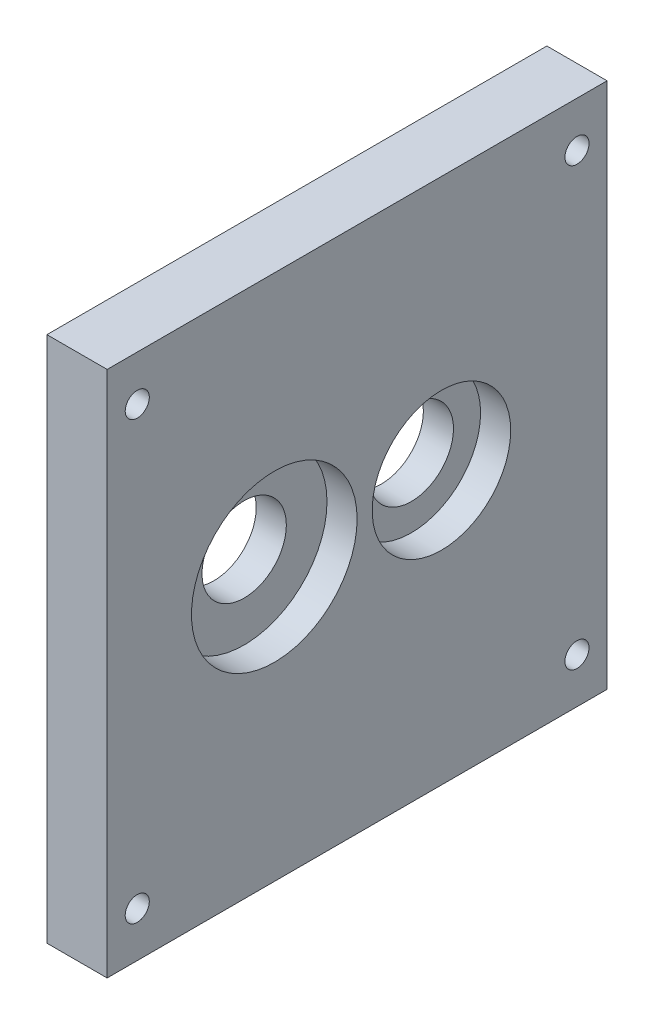
ISO-10303-21;
HEADER;
FILE_DESCRIPTION(('STEP AP214'),'2;1');
FILE_NAME('part.step','',(''),(''),'','','');
FILE_SCHEMA(('AUTOMOTIVE_DESIGN { 1 0 10303 214 1 1 1 1 }'));
ENDSEC;
DATA;
#1=APPLICATION_CONTEXT('core data for automotive mechanical design processes');
#2=APPLICATION_PROTOCOL_DEFINITION('international standard','automotive_design',2000,#1);
#3=PRODUCT_CONTEXT('',#1,'mechanical');
#4=PRODUCT('Part','Part','',(#3));
#5=PRODUCT_RELATED_PRODUCT_CATEGORY('part','',(#4));
#6=PRODUCT_DEFINITION_FORMATION('','',#4);
#7=PRODUCT_DEFINITION_CONTEXT('part definition',#1,'design');
#8=PRODUCT_DEFINITION('design','',#6,#7);
#9=PRODUCT_DEFINITION_SHAPE('','',#8);
#10=(LENGTH_UNIT() NAMED_UNIT(*) SI_UNIT(.MILLI.,.METRE.));
#11=(NAMED_UNIT(*) PLANE_ANGLE_UNIT() SI_UNIT($,.RADIAN.));
#12=(NAMED_UNIT(*) SI_UNIT($,.STERADIAN.) SOLID_ANGLE_UNIT());
#13=UNCERTAINTY_MEASURE_WITH_UNIT(LENGTH_MEASURE(1.E-05),#10,'distance_accuracy_value','');
#14=(GEOMETRIC_REPRESENTATION_CONTEXT(3) GLOBAL_UNCERTAINTY_ASSIGNED_CONTEXT((#13)) GLOBAL_UNIT_ASSIGNED_CONTEXT((#10,
#11,#12)) REPRESENTATION_CONTEXT('',''));
#15=CARTESIAN_POINT('',(0.,0.,0.));
#16=DIRECTION('',(0.,0.,1.));
#17=DIRECTION('',(1.,0.,0.));
#18=AXIS2_PLACEMENT_3D('',#15,#16,#17);
#19=CARTESIAN_POINT('',(-165.,90.5,-28.));
#20=DIRECTION('',(1.,0.,0.));
#21=DIRECTION('',(0.,0.,-1.));
#22=AXIS2_PLACEMENT_3D('',#19,#20,#21);
#23=CYLINDRICAL_SURFACE('',#22,14.);
#24=CARTESIAN_POINT('',(-9.99999999999998,90.5,-28.));
#25=DIRECTION('',(1.,0.,0.));
#26=DIRECTION('',(0.,0.,-1.));
#27=AXIS2_PLACEMENT_3D('',#24,#25,#26);
#28=CIRCLE('',#27,14.);
#29=CARTESIAN_POINT('',(-9.99999999999998,90.5,-42.));
#30=VERTEX_POINT('',#29);
#31=EDGE_CURVE('E127',#30,#30,#28,.T.);
#32=ORIENTED_EDGE('',*,*,#31,.F.);
#33=EDGE_LOOP('',(#32));
#34=FACE_BOUND('',#33,.T.);
#35=CARTESIAN_POINT('',(0.,90.5,-28.));
#36=DIRECTION('',(1.,0.,0.));
#37=DIRECTION('',(0.,0.,-1.));
#38=AXIS2_PLACEMENT_3D('',#35,#36,#37);
#39=CIRCLE('',#38,14.);
#40=CARTESIAN_POINT('',(0.,90.5,-42.));
#41=VERTEX_POINT('',#40);
#42=EDGE_CURVE('E43',#41,#41,#39,.F.);
#43=ORIENTED_EDGE('',*,*,#42,.F.);
#44=EDGE_LOOP('',(#43));
#45=FACE_BOUND('',#44,.T.);
#46=ADVANCED_FACE('F39',(#34,#45),#23,.F.);
#47=CARTESIAN_POINT('',(-165.,90.5,27.5));
#48=DIRECTION('',(1.,0.,0.));
#49=DIRECTION('',(0.,0.,-1.));
#50=AXIS2_PLACEMENT_3D('',#47,#48,#49);
#51=CYLINDRICAL_SURFACE('',#50,14.);
#52=CARTESIAN_POINT('',(-9.99999999999998,90.5,27.5));
#53=DIRECTION('',(1.,0.,0.));
#54=DIRECTION('',(0.,0.,-1.));
#55=AXIS2_PLACEMENT_3D('',#52,#53,#54);
#56=CIRCLE('',#55,14.);
#57=CARTESIAN_POINT('',(-9.99999999999998,90.5,13.5));
#58=VERTEX_POINT('',#57);
#59=EDGE_CURVE('E116',#58,#58,#56,.T.);
#60=ORIENTED_EDGE('',*,*,#59,.F.);
#61=EDGE_LOOP('',(#60));
#62=FACE_BOUND('',#61,.T.);
#63=CARTESIAN_POINT('',(0.,90.5,27.5));
#64=DIRECTION('',(1.,0.,0.));
#65=DIRECTION('',(0.,0.,-1.));
#66=AXIS2_PLACEMENT_3D('',#63,#64,#65);
#67=CIRCLE('',#66,14.);
#68=CARTESIAN_POINT('',(0.,90.5,13.5));
#69=VERTEX_POINT('',#68);
#70=EDGE_CURVE('E133',#69,#69,#67,.F.);
#71=ORIENTED_EDGE('',*,*,#70,.F.);
#72=EDGE_LOOP('',(#71));
#73=FACE_BOUND('',#72,.T.);
#74=ADVANCED_FACE('F229',(#62,#73),#51,.F.);
#75=CARTESIAN_POINT('',(10.,175.,-83.));
#76=DIRECTION('',(-1.,0.,0.));
#77=DIRECTION('',(0.,0.,1.));
#78=AXIS2_PLACEMENT_3D('',#75,#76,#77);
#79=PLANE('',#78);
#80=CARTESIAN_POINT('',(10.,160.,73.));
#81=DIRECTION('',(1.,0.,0.));
#82=DIRECTION('',(0.,0.,1.));
#83=AXIS2_PLACEMENT_3D('',#80,#81,#82);
#84=CIRCLE('',#83,4.00000000000001);
#85=CARTESIAN_POINT('',(10.,160.,77.));
#86=VERTEX_POINT('',#85);
#87=EDGE_CURVE('E170',#86,#86,#84,.T.);
#88=ORIENTED_EDGE('',*,*,#87,.F.);
#89=EDGE_LOOP('',(#88));
#90=FACE_BOUND('',#89,.T.);
#91=CARTESIAN_POINT('',(10.,15.,73.));
#92=DIRECTION('',(1.,0.,0.));
#93=DIRECTION('',(0.,0.,-1.));
#94=AXIS2_PLACEMENT_3D('',#91,#92,#93);
#95=CIRCLE('',#94,4.00000000000001);
#96=CARTESIAN_POINT('',(10.,15.,69.));
#97=VERTEX_POINT('',#96);
#98=EDGE_CURVE('E177',#97,#97,#95,.T.);
#99=ORIENTED_EDGE('',*,*,#98,.F.);
#100=EDGE_LOOP('',(#99));
#101=FACE_BOUND('',#100,.T.);
#102=CARTESIAN_POINT('',(10.,15.,-73.));
#103=DIRECTION('',(1.,0.,0.));
#104=DIRECTION('',(0.,0.,1.));
#105=AXIS2_PLACEMENT_3D('',#102,#103,#104);
#106=CIRCLE('',#105,4.00000000000001);
#107=CARTESIAN_POINT('',(10.,15.,-69.));
#108=VERTEX_POINT('',#107);
#109=EDGE_CURVE('E183',#108,#108,#106,.T.);
#110=ORIENTED_EDGE('',*,*,#109,.F.);
#111=EDGE_LOOP('',(#110));
#112=FACE_BOUND('',#111,.T.);
#113=CARTESIAN_POINT('',(10.,160.,-73.));
#114=DIRECTION('',(1.,0.,0.));
#115=DIRECTION('',(0.,0.,-1.));
#116=AXIS2_PLACEMENT_3D('',#113,#114,#115);
#117=CIRCLE('',#116,4.00000000000001);
#118=CARTESIAN_POINT('',(10.,160.,-77.));
#119=VERTEX_POINT('',#118);
#120=EDGE_CURVE('E152',#119,#119,#117,.T.);
#121=ORIENTED_EDGE('',*,*,#120,.F.);
#122=EDGE_LOOP('',(#121));
#123=FACE_BOUND('',#122,.T.);
#124=CARTESIAN_POINT('',(10.,90.5,27.5));
#125=DIRECTION('',(1.,0.,0.));
#126=DIRECTION('',(0.,0.,-1.));
#127=AXIS2_PLACEMENT_3D('',#124,#125,#126);
#128=CIRCLE('',#127,27.5);
#129=CARTESIAN_POINT('',(10.,90.5,0.));
#130=VERTEX_POINT('',#129);
#131=EDGE_CURVE('E143',#130,#130,#128,.T.);
#132=ORIENTED_EDGE('',*,*,#131,.F.);
#133=EDGE_LOOP('',(#132));
#134=FACE_BOUND('',#133,.T.);
#135=CARTESIAN_POINT('',(10.,90.5,-28.));
#136=DIRECTION('',(1.,0.,0.));
#137=DIRECTION('',(0.,0.,-1.));
#138=AXIS2_PLACEMENT_3D('',#135,#136,#137);
#139=CIRCLE('',#138,23.);
#140=CARTESIAN_POINT('',(10.,90.5,-51.));
#141=VERTEX_POINT('',#140);
#142=EDGE_CURVE('E158',#141,#141,#139,.T.);
#143=ORIENTED_EDGE('',*,*,#142,.F.);
#144=EDGE_LOOP('',(#143));
#145=FACE_BOUND('',#144,.T.);
#146=DIRECTION('',(0.,0.,-1.));
#147=VECTOR('',#146,1.);
#148=CARTESIAN_POINT('',(10.,0.,-83.));
#149=LINE('',#148,#147);
#150=CARTESIAN_POINT('',(10.,0.,83.));
#151=VERTEX_POINT('',#150);
#152=CARTESIAN_POINT('',(10.,0.,-83.));
#153=VERTEX_POINT('',#152);
#154=EDGE_CURVE('E112',#151,#153,#149,.T.);
#155=ORIENTED_EDGE('',*,*,#154,.T.);
#156=DIRECTION('',(0.,-1.,0.));
#157=VECTOR('',#156,1.);
#158=CARTESIAN_POINT('',(10.,175.,-83.));
#159=LINE('',#158,#157);
#160=CARTESIAN_POINT('',(10.,175.,-83.));
#161=VERTEX_POINT('',#160);
#162=EDGE_CURVE('E11',#161,#153,#159,.T.);
#163=ORIENTED_EDGE('',*,*,#162,.F.);
#164=DIRECTION('',(0.,0.,-1.));
#165=VECTOR('',#164,1.);
#166=CARTESIAN_POINT('',(10.,175.,-83.));
#167=LINE('',#166,#165);
#168=CARTESIAN_POINT('',(10.,175.,83.));
#169=VERTEX_POINT('',#168);
#170=EDGE_CURVE('E94',#169,#161,#167,.T.);
#171=ORIENTED_EDGE('',*,*,#170,.F.);
#172=DIRECTION('',(0.,-1.,0.));
#173=VECTOR('',#172,1.);
#174=CARTESIAN_POINT('',(10.,175.,83.));
#175=LINE('',#174,#173);
#176=EDGE_CURVE('E108',#169,#151,#175,.T.);
#177=ORIENTED_EDGE('',*,*,#176,.T.);
#178=EDGE_LOOP('',(#155,#163,#171,#177));
#179=FACE_BOUND('',#178,.T.);
#180=ADVANCED_FACE('F41',(#90,#101,#112,#123,#134,#145,#179),#79,.F.);
#181=CARTESIAN_POINT('',(10.,175.,-83.));
#182=DIRECTION('',(0.,0.,1.));
#183=DIRECTION('',(1.,0.,0.));
#184=AXIS2_PLACEMENT_3D('',#181,#182,#183);
#185=PLANE('',#184);
#186=DIRECTION('',(-1.,0.,0.));
#187=VECTOR('',#186,1.);
#188=CARTESIAN_POINT('',(10.,0.,-83.));
#189=LINE('',#188,#187);
#190=CARTESIAN_POINT('',(-9.99999999999998,0.,-83.));
#191=VERTEX_POINT('',#190);
#192=EDGE_CURVE('E99',#153,#191,#189,.T.);
#193=ORIENTED_EDGE('',*,*,#192,.T.);
#194=DIRECTION('',(0.,-1.,0.));
#195=VECTOR('',#194,1.);
#196=CARTESIAN_POINT('',(-9.99999999999998,175.,-83.));
#197=LINE('',#196,#195);
#198=CARTESIAN_POINT('',(-9.99999999999998,175.,-83.));
#199=VERTEX_POINT('',#198);
#200=EDGE_CURVE('E50',#199,#191,#197,.T.);
#201=ORIENTED_EDGE('',*,*,#200,.F.);
#202=DIRECTION('',(-1.,0.,0.));
#203=VECTOR('',#202,1.);
#204=CARTESIAN_POINT('',(10.,175.,-83.));
#205=LINE('',#204,#203);
#206=EDGE_CURVE('E89',#161,#199,#205,.T.);
#207=ORIENTED_EDGE('',*,*,#206,.F.);
#208=ORIENTED_EDGE('',*,*,#162,.T.);
#209=EDGE_LOOP('',(#193,#201,#207,#208));
#210=FACE_BOUND('',#209,.T.);
#211=ADVANCED_FACE('F98',(#210),#185,.F.);
#212=CARTESIAN_POINT('',(-9.99999999999998,175.,-83.));
#213=DIRECTION('',(1.,0.,0.));
#214=DIRECTION('',(0.,0.,-1.));
#215=AXIS2_PLACEMENT_3D('',#212,#213,#214);
#216=PLANE('',#215);
#217=CARTESIAN_POINT('',(-9.99999999999998,160.,73.));
#218=DIRECTION('',(1.,0.,0.));
#219=DIRECTION('',(0.,0.,1.));
#220=AXIS2_PLACEMENT_3D('',#217,#218,#219);
#221=CIRCLE('',#220,4.00000000000001);
#222=CARTESIAN_POINT('',(-9.99999999999998,160.,77.));
#223=VERTEX_POINT('',#222);
#224=EDGE_CURVE('E173',#223,#223,#221,.T.);
#225=ORIENTED_EDGE('',*,*,#224,.T.);
#226=EDGE_LOOP('',(#225));
#227=FACE_BOUND('',#226,.T.);
#228=CARTESIAN_POINT('',(-9.99999999999998,15.,73.));
#229=DIRECTION('',(1.,0.,0.));
#230=DIRECTION('',(0.,0.,-1.));
#231=AXIS2_PLACEMENT_3D('',#228,#229,#230);
#232=CIRCLE('',#231,4.00000000000001);
#233=CARTESIAN_POINT('',(-9.99999999999998,15.,69.));
#234=VERTEX_POINT('',#233);
#235=EDGE_CURVE('E180',#234,#234,#232,.T.);
#236=ORIENTED_EDGE('',*,*,#235,.T.);
#237=EDGE_LOOP('',(#236));
#238=FACE_BOUND('',#237,.T.);
#239=CARTESIAN_POINT('',(-9.99999999999998,15.,-73.));
#240=DIRECTION('',(1.,0.,0.));
#241=DIRECTION('',(0.,0.,1.));
#242=AXIS2_PLACEMENT_3D('',#239,#240,#241);
#243=CIRCLE('',#242,4.00000000000001);
#244=CARTESIAN_POINT('',(-9.99999999999998,15.,-69.));
#245=VERTEX_POINT('',#244);
#246=EDGE_CURVE('E168',#245,#245,#243,.T.);
#247=ORIENTED_EDGE('',*,*,#246,.T.);
#248=EDGE_LOOP('',(#247));
#249=FACE_BOUND('',#248,.T.);
#250=CARTESIAN_POINT('',(-9.99999999999998,160.,-73.));
#251=DIRECTION('',(1.,0.,0.));
#252=DIRECTION('',(0.,0.,-1.));
#253=AXIS2_PLACEMENT_3D('',#250,#251,#252);
#254=CIRCLE('',#253,4.00000000000001);
#255=CARTESIAN_POINT('',(-9.99999999999998,160.,-77.));
#256=VERTEX_POINT('',#255);
#257=EDGE_CURVE('E160',#256,#256,#254,.T.);
#258=ORIENTED_EDGE('',*,*,#257,.T.);
#259=EDGE_LOOP('',(#258));
#260=FACE_BOUND('',#259,.T.);
#261=ORIENTED_EDGE('',*,*,#59,.T.);
#262=EDGE_LOOP('',(#261));
#263=FACE_BOUND('',#262,.T.);
#264=ORIENTED_EDGE('',*,*,#31,.T.);
#265=EDGE_LOOP('',(#264));
#266=FACE_BOUND('',#265,.T.);
#267=DIRECTION('',(0.,0.,1.));
#268=VECTOR('',#267,1.);
#269=CARTESIAN_POINT('',(-9.99999999999998,0.,-83.));
#270=LINE('',#269,#268);
#271=CARTESIAN_POINT('',(-9.99999999999998,0.,83.));
#272=VERTEX_POINT('',#271);
#273=EDGE_CURVE('E76',#191,#272,#270,.T.);
#274=ORIENTED_EDGE('',*,*,#273,.T.);
#275=DIRECTION('',(0.,-1.,0.));
#276=VECTOR('',#275,1.);
#277=CARTESIAN_POINT('',(-9.99999999999998,175.,83.));
#278=LINE('',#277,#276);
#279=CARTESIAN_POINT('',(-9.99999999999998,175.,83.));
#280=VERTEX_POINT('',#279);
#281=EDGE_CURVE('E101',#280,#272,#278,.T.);
#282=ORIENTED_EDGE('',*,*,#281,.F.);
#283=DIRECTION('',(0.,0.,1.));
#284=VECTOR('',#283,1.);
#285=CARTESIAN_POINT('',(-9.99999999999998,175.,-83.));
#286=LINE('',#285,#284);
#287=EDGE_CURVE('E92',#199,#280,#286,.T.);
#288=ORIENTED_EDGE('',*,*,#287,.F.);
#289=ORIENTED_EDGE('',*,*,#200,.T.);
#290=EDGE_LOOP('',(#274,#282,#288,#289));
#291=FACE_BOUND('',#290,.T.);
#292=ADVANCED_FACE('F103',(#227,#238,#249,#260,#263,#266,#291),#216,.F.);
#293=CARTESIAN_POINT('',(10.,175.,83.));
#294=DIRECTION('',(0.,0.,-1.));
#295=DIRECTION('',(-1.,0.,0.));
#296=AXIS2_PLACEMENT_3D('',#293,#294,#295);
#297=PLANE('',#296);
#298=DIRECTION('',(1.,0.,0.));
#299=VECTOR('',#298,1.);
#300=CARTESIAN_POINT('',(10.,0.,83.));
#301=LINE('',#300,#299);
#302=EDGE_CURVE('E82',#272,#151,#301,.T.);
#303=ORIENTED_EDGE('',*,*,#302,.T.);
#304=ORIENTED_EDGE('',*,*,#176,.F.);
#305=DIRECTION('',(1.,0.,0.));
#306=VECTOR('',#305,1.);
#307=CARTESIAN_POINT('',(10.,175.,83.));
#308=LINE('',#307,#306);
#309=EDGE_CURVE('E59',#280,#169,#308,.T.);
#310=ORIENTED_EDGE('',*,*,#309,.F.);
#311=ORIENTED_EDGE('',*,*,#281,.T.);
#312=EDGE_LOOP('',(#303,#304,#310,#311));
#313=FACE_BOUND('',#312,.T.);
#314=ADVANCED_FACE('F218',(#313),#297,.F.);
#315=CARTESIAN_POINT('',(0.,175.,0.));
#316=DIRECTION('',(0.,-1.,0.));
#317=DIRECTION('',(0.,0.,-1.));
#318=AXIS2_PLACEMENT_3D('',#315,#316,#317);
#319=PLANE('',#318);
#320=ORIENTED_EDGE('',*,*,#170,.T.);
#321=ORIENTED_EDGE('',*,*,#206,.T.);
#322=ORIENTED_EDGE('',*,*,#287,.T.);
#323=ORIENTED_EDGE('',*,*,#309,.T.);
#324=EDGE_LOOP('',(#320,#321,#322,#323));
#325=FACE_BOUND('',#324,.T.);
#326=ADVANCED_FACE('F90',(#325),#319,.F.);
#327=CARTESIAN_POINT('',(0.,0.,0.));
#328=DIRECTION('',(0.,-1.,0.));
#329=DIRECTION('',(0.,0.,-1.));
#330=AXIS2_PLACEMENT_3D('',#327,#328,#329);
#331=PLANE('',#330);
#332=CARTESIAN_POINT('',(0.,0.,-50.));
#333=DIRECTION('',(0.,-1.,0.));
#334=DIRECTION('',(0.,0.,-1.));
#335=AXIS2_PLACEMENT_3D('',#332,#333,#334);
#336=CIRCLE('',#335,4.);
#337=CARTESIAN_POINT('',(0.,0.,-54.));
#338=VERTEX_POINT('',#337);
#339=EDGE_CURVE('E194',#338,#338,#336,.T.);
#340=ORIENTED_EDGE('',*,*,#339,.F.);
#341=EDGE_LOOP('',(#340));
#342=FACE_BOUND('',#341,.T.);
#343=CARTESIAN_POINT('',(0.,0.,50.));
#344=DIRECTION('',(0.,-1.,0.));
#345=DIRECTION('',(0.,0.,1.));
#346=AXIS2_PLACEMENT_3D('',#343,#344,#345);
#347=CIRCLE('',#346,4.);
#348=CARTESIAN_POINT('',(0.,0.,54.));
#349=VERTEX_POINT('',#348);
#350=EDGE_CURVE('E188',#349,#349,#347,.T.);
#351=ORIENTED_EDGE('',*,*,#350,.F.);
#352=EDGE_LOOP('',(#351));
#353=FACE_BOUND('',#352,.T.);
#354=ORIENTED_EDGE('',*,*,#154,.F.);
#355=ORIENTED_EDGE('',*,*,#302,.F.);
#356=ORIENTED_EDGE('',*,*,#273,.F.);
#357=ORIENTED_EDGE('',*,*,#192,.F.);
#358=EDGE_LOOP('',(#354,#355,#356,#357));
#359=FACE_BOUND('',#358,.T.);
#360=ADVANCED_FACE('F209',(#342,#353,#359),#331,.T.);
#361=CARTESIAN_POINT('',(0.,90.5,27.5));
#362=DIRECTION('',(1.,0.,0.));
#363=DIRECTION('',(0.,0.,-1.));
#364=AXIS2_PLACEMENT_3D('',#361,#362,#363);
#365=PLANE('',#364);
#366=CARTESIAN_POINT('',(0.,90.5,27.5));
#367=DIRECTION('',(1.,0.,0.));
#368=DIRECTION('',(0.,0.,-1.));
#369=AXIS2_PLACEMENT_3D('',#366,#367,#368);
#370=CIRCLE('',#369,27.5);
#371=CARTESIAN_POINT('',(0.,90.5,0.));
#372=VERTEX_POINT('',#371);
#373=EDGE_CURVE('E136',#372,#372,#370,.T.);
#374=ORIENTED_EDGE('',*,*,#373,.T.);
#375=EDGE_LOOP('',(#374));
#376=FACE_BOUND('',#375,.T.);
#377=ORIENTED_EDGE('',*,*,#70,.T.);
#378=EDGE_LOOP('',(#377));
#379=FACE_BOUND('',#378,.T.);
#380=ADVANCED_FACE('F212',(#376,#379),#365,.T.);
#381=CARTESIAN_POINT('',(0.,90.5,27.5));
#382=DIRECTION('',(1.,0.,0.));
#383=DIRECTION('',(0.,0.,-1.));
#384=AXIS2_PLACEMENT_3D('',#381,#382,#383);
#385=CYLINDRICAL_SURFACE('',#384,27.5);
#386=ORIENTED_EDGE('',*,*,#373,.F.);
#387=EDGE_LOOP('',(#386));
#388=FACE_BOUND('',#387,.T.);
#389=ORIENTED_EDGE('',*,*,#131,.T.);
#390=EDGE_LOOP('',(#389));
#391=FACE_BOUND('',#390,.T.);
#392=ADVANCED_FACE('F248',(#388,#391),#385,.F.);
#393=CARTESIAN_POINT('',(0.,90.5,-28.));
#394=DIRECTION('',(1.,0.,0.));
#395=DIRECTION('',(0.,0.,-1.));
#396=AXIS2_PLACEMENT_3D('',#393,#394,#395);
#397=PLANE('',#396);
#398=CARTESIAN_POINT('',(0.,90.5,-28.));
#399=DIRECTION('',(1.,0.,0.));
#400=DIRECTION('',(0.,0.,-1.));
#401=AXIS2_PLACEMENT_3D('',#398,#399,#400);
#402=CIRCLE('',#401,23.);
#403=CARTESIAN_POINT('',(0.,90.5,-51.));
#404=VERTEX_POINT('',#403);
#405=EDGE_CURVE('E149',#404,#404,#402,.T.);
#406=ORIENTED_EDGE('',*,*,#405,.T.);
#407=EDGE_LOOP('',(#406));
#408=FACE_BOUND('',#407,.T.);
#409=ORIENTED_EDGE('',*,*,#42,.T.);
#410=EDGE_LOOP('',(#409));
#411=FACE_BOUND('',#410,.T.);
#412=ADVANCED_FACE('F244',(#408,#411),#397,.T.);
#413=CARTESIAN_POINT('',(0.,90.5,-28.));
#414=DIRECTION('',(1.,0.,0.));
#415=DIRECTION('',(0.,0.,-1.));
#416=AXIS2_PLACEMENT_3D('',#413,#414,#415);
#417=CYLINDRICAL_SURFACE('',#416,23.);
#418=ORIENTED_EDGE('',*,*,#405,.F.);
#419=EDGE_LOOP('',(#418));
#420=FACE_BOUND('',#419,.T.);
#421=ORIENTED_EDGE('',*,*,#142,.T.);
#422=EDGE_LOOP('',(#421));
#423=FACE_BOUND('',#422,.T.);
#424=ADVANCED_FACE('F240',(#420,#423),#417,.F.);
#425=CARTESIAN_POINT('',(-9.99999999999998,160.,-73.));
#426=DIRECTION('',(1.,0.,0.));
#427=DIRECTION('',(0.,0.,-1.));
#428=AXIS2_PLACEMENT_3D('',#425,#426,#427);
#429=CYLINDRICAL_SURFACE('',#428,4.00000000000001);
#430=ORIENTED_EDGE('',*,*,#257,.F.);
#431=EDGE_LOOP('',(#430));
#432=FACE_BOUND('',#431,.T.);
#433=ORIENTED_EDGE('',*,*,#120,.T.);
#434=EDGE_LOOP('',(#433));
#435=FACE_BOUND('',#434,.T.);
#436=ADVANCED_FACE('F243',(#432,#435),#429,.F.);
#437=CARTESIAN_POINT('',(-9.99999999999998,15.,-73.));
#438=DIRECTION('',(1.,0.,0.));
#439=DIRECTION('',(0.,0.,-1.));
#440=AXIS2_PLACEMENT_3D('',#437,#438,#439);
#441=CYLINDRICAL_SURFACE('',#440,4.00000000000001);
#442=ORIENTED_EDGE('',*,*,#246,.F.);
#443=EDGE_LOOP('',(#442));
#444=FACE_BOUND('',#443,.T.);
#445=ORIENTED_EDGE('',*,*,#109,.T.);
#446=EDGE_LOOP('',(#445));
#447=FACE_BOUND('',#446,.T.);
#448=ADVANCED_FACE('F257',(#444,#447),#441,.F.);
#449=CARTESIAN_POINT('',(-9.99999999999998,15.,73.));
#450=DIRECTION('',(1.,0.,0.));
#451=DIRECTION('',(0.,0.,-1.));
#452=AXIS2_PLACEMENT_3D('',#449,#450,#451);
#453=CYLINDRICAL_SURFACE('',#452,4.00000000000001);
#454=ORIENTED_EDGE('',*,*,#235,.F.);
#455=EDGE_LOOP('',(#454));
#456=FACE_BOUND('',#455,.T.);
#457=ORIENTED_EDGE('',*,*,#98,.T.);
#458=EDGE_LOOP('',(#457));
#459=FACE_BOUND('',#458,.T.);
#460=ADVANCED_FACE('F263',(#456,#459),#453,.F.);
#461=CARTESIAN_POINT('',(-9.99999999999998,160.,73.));
#462=DIRECTION('',(1.,0.,0.));
#463=DIRECTION('',(0.,0.,-1.));
#464=AXIS2_PLACEMENT_3D('',#461,#462,#463);
#465=CYLINDRICAL_SURFACE('',#464,4.00000000000001);
#466=ORIENTED_EDGE('',*,*,#224,.F.);
#467=EDGE_LOOP('',(#466));
#468=FACE_BOUND('',#467,.T.);
#469=ORIENTED_EDGE('',*,*,#87,.T.);
#470=EDGE_LOOP('',(#469));
#471=FACE_BOUND('',#470,.T.);
#472=ADVANCED_FACE('F259',(#468,#471),#465,.F.);
#473=CARTESIAN_POINT('',(0.,15.,50.));
#474=DIRECTION('',(0.,-1.,0.));
#475=DIRECTION('',(0.,0.,-1.));
#476=AXIS2_PLACEMENT_3D('',#473,#474,#475);
#477=CYLINDRICAL_SURFACE('',#476,4.);
#478=CARTESIAN_POINT('',(0.,15.,50.));
#479=DIRECTION('',(0.,-1.,0.));
#480=DIRECTION('',(0.,0.,1.));
#481=AXIS2_PLACEMENT_3D('',#478,#479,#480);
#482=CIRCLE('',#481,4.);
#483=CARTESIAN_POINT('',(0.,15.,54.));
#484=VERTEX_POINT('',#483);
#485=EDGE_CURVE('E191',#484,#484,#482,.T.);
#486=ORIENTED_EDGE('',*,*,#485,.F.);
#487=EDGE_LOOP('',(#486));
#488=FACE_BOUND('',#487,.T.);
#489=ORIENTED_EDGE('',*,*,#350,.T.);
#490=EDGE_LOOP('',(#489));
#491=FACE_BOUND('',#490,.T.);
#492=ADVANCED_FACE('F262',(#488,#491),#477,.F.);
#493=CARTESIAN_POINT('',(0.,15.,50.));
#494=DIRECTION('',(0.,1.,0.));
#495=DIRECTION('',(0.,0.,1.));
#496=AXIS2_PLACEMENT_3D('',#493,#494,#495);
#497=PLANE('',#496);
#498=ORIENTED_EDGE('',*,*,#485,.T.);
#499=EDGE_LOOP('',(#498));
#500=FACE_BOUND('',#499,.T.);
#501=ADVANCED_FACE('F205',(#500),#497,.F.);
#502=CARTESIAN_POINT('',(0.,15.,-50.));
#503=DIRECTION('',(0.,-1.,0.));
#504=DIRECTION('',(0.,0.,-1.));
#505=AXIS2_PLACEMENT_3D('',#502,#503,#504);
#506=CYLINDRICAL_SURFACE('',#505,4.);
#507=CARTESIAN_POINT('',(0.,15.,-50.));
#508=DIRECTION('',(0.,-1.,0.));
#509=DIRECTION('',(0.,0.,-1.));
#510=AXIS2_PLACEMENT_3D('',#507,#508,#509);
#511=CIRCLE('',#510,4.);
#512=CARTESIAN_POINT('',(0.,15.,-54.));
#513=VERTEX_POINT('',#512);
#514=EDGE_CURVE('E174',#513,#513,#511,.T.);
#515=ORIENTED_EDGE('',*,*,#514,.F.);
#516=EDGE_LOOP('',(#515));
#517=FACE_BOUND('',#516,.T.);
#518=ORIENTED_EDGE('',*,*,#339,.T.);
#519=EDGE_LOOP('',(#518));
#520=FACE_BOUND('',#519,.T.);
#521=ADVANCED_FACE('F202',(#517,#520),#506,.F.);
#522=CARTESIAN_POINT('',(0.,15.,-50.));
#523=DIRECTION('',(0.,-1.,0.));
#524=DIRECTION('',(0.,0.,-1.));
#525=AXIS2_PLACEMENT_3D('',#522,#523,#524);
#526=PLANE('',#525);
#527=ORIENTED_EDGE('',*,*,#514,.T.);
#528=EDGE_LOOP('',(#527));
#529=FACE_BOUND('',#528,.T.);
#530=ADVANCED_FACE('F200',(#529),#526,.T.);
#531=CLOSED_SHELL('',(#46,#74,#180,#211,#292,#314,#326,#360,#380,#392,#412,#424,#436,#448,#460,
#472,#492,#501,#521,#530));
#532=MANIFOLD_SOLID_BREP('B2',#531);
#533=ADVANCED_BREP_SHAPE_REPRESENTATION('',(#18,#532),#14);
#534=SHAPE_DEFINITION_REPRESENTATION(#9,#533);
ENDSEC;
END-ISO-10303-21;
